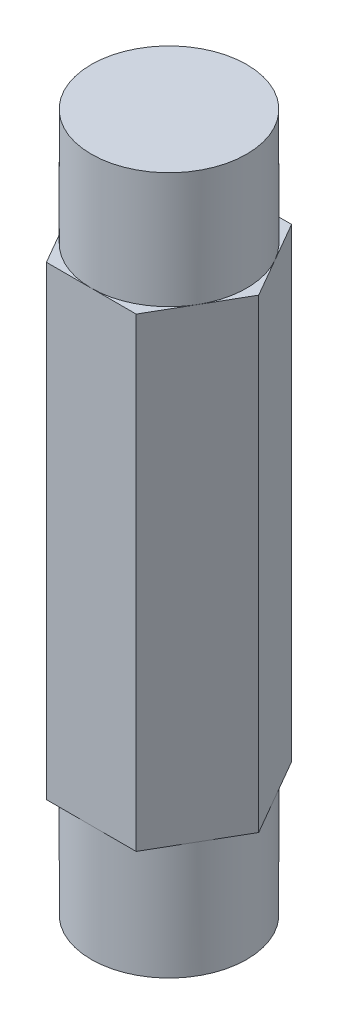
ISO-10303-21;
HEADER;
FILE_DESCRIPTION(('STEP AP214'),'2;1');
FILE_NAME('part.step','',(''),(''),'','','');
FILE_SCHEMA(('AUTOMOTIVE_DESIGN { 1 0 10303 214 1 1 1 1 }'));
ENDSEC;
DATA;
#1=APPLICATION_CONTEXT('core data for automotive mechanical design processes');
#2=APPLICATION_PROTOCOL_DEFINITION('international standard','automotive_design',2000,#1);
#3=PRODUCT_CONTEXT('',#1,'mechanical');
#4=PRODUCT('Part','Part','',(#3));
#5=PRODUCT_RELATED_PRODUCT_CATEGORY('part','',(#4));
#6=PRODUCT_DEFINITION_FORMATION('','',#4);
#7=PRODUCT_DEFINITION_CONTEXT('part definition',#1,'design');
#8=PRODUCT_DEFINITION('design','',#6,#7);
#9=PRODUCT_DEFINITION_SHAPE('','',#8);
#10=(LENGTH_UNIT() NAMED_UNIT(*) SI_UNIT(.MILLI.,.METRE.));
#11=(NAMED_UNIT(*) PLANE_ANGLE_UNIT() SI_UNIT($,.RADIAN.));
#12=(NAMED_UNIT(*) SI_UNIT($,.STERADIAN.) SOLID_ANGLE_UNIT());
#13=UNCERTAINTY_MEASURE_WITH_UNIT(LENGTH_MEASURE(1.E-05),#10,'distance_accuracy_value','');
#14=(GEOMETRIC_REPRESENTATION_CONTEXT(3) GLOBAL_UNCERTAINTY_ASSIGNED_CONTEXT((#13)) GLOBAL_UNIT_ASSIGNED_CONTEXT((#10,
#11,#12)) REPRESENTATION_CONTEXT('',''));
#15=CARTESIAN_POINT('',(0.,0.,0.));
#16=DIRECTION('',(0.,0.,1.));
#17=DIRECTION('',(1.,0.,0.));
#18=AXIS2_PLACEMENT_3D('',#15,#16,#17);
#19=CARTESIAN_POINT('',(2.74963065701559,42.7482,-4.7625));
#20=DIRECTION('',(-0.866025403784439,0.,0.5));
#21=DIRECTION('',(-0.5,0.,-0.866025403784439));
#22=AXIS2_PLACEMENT_3D('',#19,#20,#21);
#23=PLANE('',#22);
#24=DIRECTION('',(-0.5,0.,-0.866025403784439));
#25=VECTOR('',#24,1.);
#26=CARTESIAN_POINT('',(2.74963065701559,7.112,-4.7625));
#27=LINE('',#26,#25);
#28=CARTESIAN_POINT('',(5.49926131403118,7.112,0.));
#29=VERTEX_POINT('',#28);
#30=CARTESIAN_POINT('',(4.12444598552339,7.112,-2.38125));
#31=VERTEX_POINT('',#30);
#32=EDGE_CURVE('E301',#29,#31,#27,.T.);
#33=ORIENTED_EDGE('',*,*,#32,.T.);
#34=CARTESIAN_POINT('',(2.74963065701559,7.112,-4.7625));
#35=VERTEX_POINT('',#34);
#36=EDGE_CURVE('E304',#31,#35,#27,.T.);
#37=ORIENTED_EDGE('',*,*,#36,.T.);
#38=DIRECTION('',(0.,-1.,0.));
#39=VECTOR('',#38,1.);
#40=CARTESIAN_POINT('',(2.74963065701559,42.7482,-4.7625));
#41=LINE('',#40,#39);
#42=CARTESIAN_POINT('',(2.74963065701559,35.6362,-4.7625));
#43=VERTEX_POINT('',#42);
#44=EDGE_CURVE('E184',#43,#35,#41,.T.);
#45=ORIENTED_EDGE('',*,*,#44,.F.);
#46=DIRECTION('',(0.5,0.,0.866025403784439));
#47=VECTOR('',#46,1.);
#48=CARTESIAN_POINT('',(2.74963065701559,35.6362,-4.7625));
#49=LINE('',#48,#47);
#50=CARTESIAN_POINT('',(4.12444598552339,35.6362,-2.38125));
#51=VERTEX_POINT('',#50);
#52=EDGE_CURVE('E183',#43,#51,#49,.T.);
#53=ORIENTED_EDGE('',*,*,#52,.T.);
#54=CARTESIAN_POINT('',(5.49926131403118,35.6362,0.));
#55=VERTEX_POINT('',#54);
#56=EDGE_CURVE('E180',#51,#55,#49,.T.);
#57=ORIENTED_EDGE('',*,*,#56,.T.);
#58=DIRECTION('',(0.,-1.,0.));
#59=VECTOR('',#58,1.);
#60=CARTESIAN_POINT('',(5.49926131403118,42.7482,0.));
#61=LINE('',#60,#59);
#62=EDGE_CURVE('E196',#55,#29,#61,.T.);
#63=ORIENTED_EDGE('',*,*,#62,.T.);
#64=EDGE_LOOP('',(#33,#37,#45,#53,#57,#63));
#65=FACE_BOUND('',#64,.T.);
#66=ADVANCED_FACE('F35',(#65),#23,.F.);
#67=CARTESIAN_POINT('',(5.49926131403118,42.7482,0.));
#68=DIRECTION('',(-0.866025403784439,0.,-0.5));
#69=DIRECTION('',(0.5,0.,-0.866025403784439));
#70=AXIS2_PLACEMENT_3D('',#67,#68,#69);
#71=PLANE('',#70);
#72=DIRECTION('',(0.5,0.,-0.866025403784439));
#73=VECTOR('',#72,1.);
#74=CARTESIAN_POINT('',(5.49926131403118,7.112,0.));
#75=LINE('',#74,#73);
#76=CARTESIAN_POINT('',(2.74963065701559,7.112,4.7625));
#77=VERTEX_POINT('',#76);
#78=CARTESIAN_POINT('',(4.12444598552339,7.112,2.38125));
#79=VERTEX_POINT('',#78);
#80=EDGE_CURVE('E146',#77,#79,#75,.T.);
#81=ORIENTED_EDGE('',*,*,#80,.T.);
#82=EDGE_CURVE('E160',#79,#29,#75,.T.);
#83=ORIENTED_EDGE('',*,*,#82,.T.);
#84=ORIENTED_EDGE('',*,*,#62,.F.);
#85=DIRECTION('',(-0.5,0.,0.866025403784439));
#86=VECTOR('',#85,1.);
#87=CARTESIAN_POINT('',(5.49926131403118,35.6362,0.));
#88=LINE('',#87,#86);
#89=CARTESIAN_POINT('',(4.12444598552339,35.6362,2.38125));
#90=VERTEX_POINT('',#89);
#91=EDGE_CURVE('E179',#55,#90,#88,.T.);
#92=ORIENTED_EDGE('',*,*,#91,.T.);
#93=CARTESIAN_POINT('',(2.74963065701559,35.6362,4.7625));
#94=VERTEX_POINT('',#93);
#95=EDGE_CURVE('E176',#90,#94,#88,.T.);
#96=ORIENTED_EDGE('',*,*,#95,.T.);
#97=DIRECTION('',(0.,-1.,0.));
#98=VECTOR('',#97,1.);
#99=CARTESIAN_POINT('',(2.74963065701559,42.7482,4.7625));
#100=LINE('',#99,#98);
#101=EDGE_CURVE('E194',#94,#77,#100,.T.);
#102=ORIENTED_EDGE('',*,*,#101,.T.);
#103=EDGE_LOOP('',(#81,#83,#84,#92,#96,#102));
#104=FACE_BOUND('',#103,.T.);
#105=ADVANCED_FACE('F244',(#104),#71,.F.);
#106=CARTESIAN_POINT('',(2.74963065701559,42.7482,4.7625));
#107=DIRECTION('',(0.,0.,-1.));
#108=DIRECTION('',(1.,0.,0.));
#109=AXIS2_PLACEMENT_3D('',#106,#107,#108);
#110=PLANE('',#109);
#111=DIRECTION('',(1.,0.,0.));
#112=VECTOR('',#111,1.);
#113=CARTESIAN_POINT('',(2.74963065701559,7.112,4.7625));
#114=LINE('',#113,#112);
#115=CARTESIAN_POINT('',(-2.74963065701559,7.112,4.7625));
#116=VERTEX_POINT('',#115);
#117=CARTESIAN_POINT('',(0.,7.112,4.7625));
#118=VERTEX_POINT('',#117);
#119=EDGE_CURVE('E139',#116,#118,#114,.T.);
#120=ORIENTED_EDGE('',*,*,#119,.T.);
#121=EDGE_CURVE('E143',#118,#77,#114,.T.);
#122=ORIENTED_EDGE('',*,*,#121,.T.);
#123=ORIENTED_EDGE('',*,*,#101,.F.);
#124=DIRECTION('',(-1.,0.,0.));
#125=VECTOR('',#124,1.);
#126=CARTESIAN_POINT('',(2.74963065701559,35.6362,4.7625));
#127=LINE('',#126,#125);
#128=CARTESIAN_POINT('',(0.,35.6362,4.7625));
#129=VERTEX_POINT('',#128);
#130=EDGE_CURVE('E175',#94,#129,#127,.T.);
#131=ORIENTED_EDGE('',*,*,#130,.T.);
#132=CARTESIAN_POINT('',(-2.74963065701559,35.6362,4.7625));
#133=VERTEX_POINT('',#132);
#134=EDGE_CURVE('E173',#129,#133,#127,.T.);
#135=ORIENTED_EDGE('',*,*,#134,.T.);
#136=DIRECTION('',(0.,-1.,0.));
#137=VECTOR('',#136,1.);
#138=CARTESIAN_POINT('',(-2.74963065701559,42.7482,4.7625));
#139=LINE('',#138,#137);
#140=EDGE_CURVE('E155',#133,#116,#139,.T.);
#141=ORIENTED_EDGE('',*,*,#140,.T.);
#142=EDGE_LOOP('',(#120,#122,#123,#131,#135,#141));
#143=FACE_BOUND('',#142,.T.);
#144=ADVANCED_FACE('F152',(#143),#110,.F.);
#145=CARTESIAN_POINT('',(-2.74963065701559,42.7482,4.7625));
#146=DIRECTION('',(0.866025403784439,0.,-0.5));
#147=DIRECTION('',(0.5,0.,0.866025403784439));
#148=AXIS2_PLACEMENT_3D('',#145,#146,#147);
#149=PLANE('',#148);
#150=DIRECTION('',(0.5,0.,0.866025403784439));
#151=VECTOR('',#150,1.);
#152=CARTESIAN_POINT('',(-2.74963065701559,7.112,4.7625));
#153=LINE('',#152,#151);
#154=CARTESIAN_POINT('',(-5.49926131403119,7.112,0.));
#155=VERTEX_POINT('',#154);
#156=CARTESIAN_POINT('',(-4.12444598552339,7.112,2.38125));
#157=VERTEX_POINT('',#156);
#158=EDGE_CURVE('E298',#155,#157,#153,.T.);
#159=ORIENTED_EDGE('',*,*,#158,.T.);
#160=EDGE_CURVE('E140',#157,#116,#153,.T.);
#161=ORIENTED_EDGE('',*,*,#160,.T.);
#162=ORIENTED_EDGE('',*,*,#140,.F.);
#163=DIRECTION('',(-0.5,0.,-0.866025403784439));
#164=VECTOR('',#163,1.);
#165=CARTESIAN_POINT('',(-2.74963065701559,35.6362,4.7625));
#166=LINE('',#165,#164);
#167=CARTESIAN_POINT('',(-4.12444598552339,35.6362,2.38125));
#168=VERTEX_POINT('',#167);
#169=EDGE_CURVE('E172',#133,#168,#166,.T.);
#170=ORIENTED_EDGE('',*,*,#169,.T.);
#171=CARTESIAN_POINT('',(-5.49926131403119,35.6362,0.));
#172=VERTEX_POINT('',#171);
#173=EDGE_CURVE('E169',#168,#172,#166,.T.);
#174=ORIENTED_EDGE('',*,*,#173,.T.);
#175=DIRECTION('',(0.,-1.,0.));
#176=VECTOR('',#175,1.);
#177=CARTESIAN_POINT('',(-5.49926131403119,42.7482,0.));
#178=LINE('',#177,#176);
#179=EDGE_CURVE('E190',#172,#155,#178,.T.);
#180=ORIENTED_EDGE('',*,*,#179,.T.);
#181=EDGE_LOOP('',(#159,#161,#162,#170,#174,#180));
#182=FACE_BOUND('',#181,.T.);
#183=ADVANCED_FACE('F272',(#182),#149,.F.);
#184=CARTESIAN_POINT('',(-5.49926131403119,42.7482,0.));
#185=DIRECTION('',(0.866025403784439,0.,0.5));
#186=DIRECTION('',(-0.5,0.,0.866025403784439));
#187=AXIS2_PLACEMENT_3D('',#184,#185,#186);
#188=PLANE('',#187);
#189=DIRECTION('',(-0.5,0.,0.866025403784439));
#190=VECTOR('',#189,1.);
#191=CARTESIAN_POINT('',(-5.49926131403119,7.112,0.));
#192=LINE('',#191,#190);
#193=CARTESIAN_POINT('',(-2.74963065701559,7.112,-4.7625));
#194=VERTEX_POINT('',#193);
#195=CARTESIAN_POINT('',(-4.12444598552339,7.112,-2.38125));
#196=VERTEX_POINT('',#195);
#197=EDGE_CURVE('E133',#194,#196,#192,.T.);
#198=ORIENTED_EDGE('',*,*,#197,.T.);
#199=EDGE_CURVE('E299',#196,#155,#192,.T.);
#200=ORIENTED_EDGE('',*,*,#199,.T.);
#201=ORIENTED_EDGE('',*,*,#179,.F.);
#202=DIRECTION('',(0.5,0.,-0.866025403784439));
#203=VECTOR('',#202,1.);
#204=CARTESIAN_POINT('',(-5.49926131403119,35.6362,0.));
#205=LINE('',#204,#203);
#206=CARTESIAN_POINT('',(-4.12444598552339,35.6362,-2.38125));
#207=VERTEX_POINT('',#206);
#208=EDGE_CURVE('E168',#172,#207,#205,.T.);
#209=ORIENTED_EDGE('',*,*,#208,.T.);
#210=CARTESIAN_POINT('',(-2.74963065701559,35.6362,-4.7625));
#211=VERTEX_POINT('',#210);
#212=EDGE_CURVE('E164',#207,#211,#205,.T.);
#213=ORIENTED_EDGE('',*,*,#212,.T.);
#214=DIRECTION('',(0.,-1.,0.));
#215=VECTOR('',#214,1.);
#216=CARTESIAN_POINT('',(-2.74963065701559,42.7482,-4.7625));
#217=LINE('',#216,#215);
#218=EDGE_CURVE('E187',#211,#194,#217,.T.);
#219=ORIENTED_EDGE('',*,*,#218,.T.);
#220=EDGE_LOOP('',(#198,#200,#201,#209,#213,#219));
#221=FACE_BOUND('',#220,.T.);
#222=ADVANCED_FACE('F219',(#221),#188,.F.);
#223=CARTESIAN_POINT('',(-2.74963065701559,42.7482,-4.7625));
#224=DIRECTION('',(0.,0.,1.));
#225=DIRECTION('',(-1.,0.,0.));
#226=AXIS2_PLACEMENT_3D('',#223,#224,#225);
#227=PLANE('',#226);
#228=DIRECTION('',(-1.,0.,0.));
#229=VECTOR('',#228,1.);
#230=CARTESIAN_POINT('',(-2.74963065701559,7.112,-4.7625));
#231=LINE('',#230,#229);
#232=CARTESIAN_POINT('',(0.,7.112,-4.7625));
#233=VERTEX_POINT('',#232);
#234=EDGE_CURVE('E11',#35,#233,#231,.T.);
#235=ORIENTED_EDGE('',*,*,#234,.T.);
#236=EDGE_CURVE('E38',#233,#194,#231,.T.);
#237=ORIENTED_EDGE('',*,*,#236,.T.);
#238=ORIENTED_EDGE('',*,*,#218,.F.);
#239=DIRECTION('',(1.,0.,0.));
#240=VECTOR('',#239,1.);
#241=CARTESIAN_POINT('',(-2.74963065701559,35.6362,-4.7625));
#242=LINE('',#241,#240);
#243=CARTESIAN_POINT('',(0.,35.6362,-4.7625));
#244=VERTEX_POINT('',#243);
#245=EDGE_CURVE('E203',#211,#244,#242,.T.);
#246=ORIENTED_EDGE('',*,*,#245,.T.);
#247=EDGE_CURVE('E202',#244,#43,#242,.T.);
#248=ORIENTED_EDGE('',*,*,#247,.T.);
#249=ORIENTED_EDGE('',*,*,#44,.T.);
#250=EDGE_LOOP('',(#235,#237,#238,#246,#248,#249));
#251=FACE_BOUND('',#250,.T.);
#252=ADVANCED_FACE('F211',(#251),#227,.F.);
#253=CARTESIAN_POINT('',(0.,35.6362,0.));
#254=DIRECTION('',(0.,1.,0.));
#255=DIRECTION('',(0.,0.,-1.));
#256=AXIS2_PLACEMENT_3D('',#253,#254,#255);
#257=PLANE('',#256);
#258=ORIENTED_EDGE('',*,*,#52,.F.);
#259=ORIENTED_EDGE('',*,*,#247,.F.);
#260=CARTESIAN_POINT('',(0.,35.6362,0.));
#261=DIRECTION('',(0.,-1.,0.));
#262=DIRECTION('',(0.,0.,-1.));
#263=AXIS2_PLACEMENT_3D('',#260,#261,#262);
#264=CIRCLE('',#263,4.7625);
#265=EDGE_CURVE('E158',#244,#51,#264,.T.);
#266=ORIENTED_EDGE('',*,*,#265,.T.);
#267=EDGE_LOOP('',(#258,#259,#266));
#268=FACE_BOUND('',#267,.T.);
#269=ADVANCED_FACE('F251',(#268),#257,.T.);
#270=ORIENTED_EDGE('',*,*,#56,.F.);
#271=EDGE_CURVE('E165',#51,#90,#264,.T.);
#272=ORIENTED_EDGE('',*,*,#271,.T.);
#273=ORIENTED_EDGE('',*,*,#91,.F.);
#274=EDGE_LOOP('',(#270,#272,#273));
#275=FACE_BOUND('',#274,.T.);
#276=ADVANCED_FACE('F237',(#275),#257,.T.);
#277=ORIENTED_EDGE('',*,*,#95,.F.);
#278=EDGE_CURVE('E228',#90,#129,#264,.T.);
#279=ORIENTED_EDGE('',*,*,#278,.T.);
#280=ORIENTED_EDGE('',*,*,#130,.F.);
#281=EDGE_LOOP('',(#277,#279,#280));
#282=FACE_BOUND('',#281,.T.);
#283=ADVANCED_FACE('F241',(#282),#257,.T.);
#284=ORIENTED_EDGE('',*,*,#134,.F.);
#285=EDGE_CURVE('E227',#129,#168,#264,.T.);
#286=ORIENTED_EDGE('',*,*,#285,.T.);
#287=ORIENTED_EDGE('',*,*,#169,.F.);
#288=EDGE_LOOP('',(#284,#286,#287));
#289=FACE_BOUND('',#288,.T.);
#290=ADVANCED_FACE('F291',(#289),#257,.T.);
#291=ORIENTED_EDGE('',*,*,#173,.F.);
#292=EDGE_CURVE('E156',#168,#207,#264,.T.);
#293=ORIENTED_EDGE('',*,*,#292,.T.);
#294=ORIENTED_EDGE('',*,*,#208,.F.);
#295=EDGE_LOOP('',(#291,#293,#294));
#296=FACE_BOUND('',#295,.T.);
#297=ADVANCED_FACE('F223',(#296),#257,.T.);
#298=ORIENTED_EDGE('',*,*,#212,.F.);
#299=EDGE_CURVE('E57',#207,#244,#264,.T.);
#300=ORIENTED_EDGE('',*,*,#299,.T.);
#301=ORIENTED_EDGE('',*,*,#245,.F.);
#302=EDGE_LOOP('',(#298,#300,#301));
#303=FACE_BOUND('',#302,.T.);
#304=ADVANCED_FACE('F214',(#303),#257,.T.);
#305=CARTESIAN_POINT('',(0.,35.6362,0.));
#306=DIRECTION('',(0.,1.,0.));
#307=DIRECTION('',(0.,0.,-1.));
#308=AXIS2_PLACEMENT_3D('',#305,#306,#307);
#309=CYLINDRICAL_SURFACE('',#308,4.7625);
#310=CARTESIAN_POINT('',(0.,42.7482,0.));
#311=DIRECTION('',(0.,-1.,0.));
#312=DIRECTION('',(0.,0.,-1.));
#313=AXIS2_PLACEMENT_3D('',#310,#311,#312);
#314=CIRCLE('',#313,4.7625);
#315=CARTESIAN_POINT('',(0.,42.7482,-4.7625));
#316=VERTEX_POINT('',#315);
#317=EDGE_CURVE('E199',#316,#316,#314,.T.);
#318=ORIENTED_EDGE('',*,*,#317,.T.);
#319=EDGE_LOOP('',(#318));
#320=FACE_BOUND('',#319,.T.);
#321=ORIENTED_EDGE('',*,*,#265,.F.);
#322=ORIENTED_EDGE('',*,*,#299,.F.);
#323=ORIENTED_EDGE('',*,*,#292,.F.);
#324=ORIENTED_EDGE('',*,*,#285,.F.);
#325=ORIENTED_EDGE('',*,*,#278,.F.);
#326=ORIENTED_EDGE('',*,*,#271,.F.);
#327=EDGE_LOOP('',(#321,#322,#323,#324,#325,#326));
#328=FACE_BOUND('',#327,.T.);
#329=ADVANCED_FACE('F252',(#320,#328),#309,.T.);
#330=CARTESIAN_POINT('',(0.,42.7482,0.));
#331=DIRECTION('',(0.,1.,0.));
#332=DIRECTION('',(0.,0.,-1.));
#333=AXIS2_PLACEMENT_3D('',#330,#331,#332);
#334=PLANE('',#333);
#335=ORIENTED_EDGE('',*,*,#317,.F.);
#336=EDGE_LOOP('',(#335));
#337=FACE_BOUND('',#336,.T.);
#338=ADVANCED_FACE('F254',(#337),#334,.T.);
#339=CARTESIAN_POINT('',(0.,7.112,0.));
#340=DIRECTION('',(0.,-1.,0.));
#341=DIRECTION('',(0.,0.,1.));
#342=AXIS2_PLACEMENT_3D('',#339,#340,#341);
#343=PLANE('',#342);
#344=ORIENTED_EDGE('',*,*,#119,.F.);
#345=ORIENTED_EDGE('',*,*,#160,.F.);
#346=CARTESIAN_POINT('',(0.,7.112,0.));
#347=DIRECTION('',(0.,1.,0.));
#348=DIRECTION('',(0.,0.,1.));
#349=AXIS2_PLACEMENT_3D('',#346,#347,#348);
#350=CIRCLE('',#349,4.7625);
#351=EDGE_CURVE('E125',#157,#118,#350,.T.);
#352=ORIENTED_EDGE('',*,*,#351,.T.);
#353=EDGE_LOOP('',(#344,#345,#352));
#354=FACE_BOUND('',#353,.T.);
#355=ADVANCED_FACE('F137',(#354),#343,.T.);
#356=ORIENTED_EDGE('',*,*,#121,.F.);
#357=EDGE_CURVE('E122',#118,#79,#350,.T.);
#358=ORIENTED_EDGE('',*,*,#357,.T.);
#359=ORIENTED_EDGE('',*,*,#80,.F.);
#360=EDGE_LOOP('',(#356,#358,#359));
#361=FACE_BOUND('',#360,.T.);
#362=ADVANCED_FACE('F144',(#361),#343,.T.);
#363=ORIENTED_EDGE('',*,*,#82,.F.);
#364=EDGE_CURVE('E128',#79,#31,#350,.T.);
#365=ORIENTED_EDGE('',*,*,#364,.T.);
#366=ORIENTED_EDGE('',*,*,#32,.F.);
#367=EDGE_LOOP('',(#363,#365,#366));
#368=FACE_BOUND('',#367,.T.);
#369=ADVANCED_FACE('F315',(#368),#343,.T.);
#370=ORIENTED_EDGE('',*,*,#158,.F.);
#371=ORIENTED_EDGE('',*,*,#199,.F.);
#372=EDGE_CURVE('E142',#196,#157,#350,.T.);
#373=ORIENTED_EDGE('',*,*,#372,.T.);
#374=EDGE_LOOP('',(#370,#371,#373));
#375=FACE_BOUND('',#374,.T.);
#376=ADVANCED_FACE('F312',(#375),#343,.T.);
#377=ORIENTED_EDGE('',*,*,#36,.F.);
#378=EDGE_CURVE('E310',#31,#233,#350,.T.);
#379=ORIENTED_EDGE('',*,*,#378,.T.);
#380=ORIENTED_EDGE('',*,*,#234,.F.);
#381=EDGE_LOOP('',(#377,#379,#380));
#382=FACE_BOUND('',#381,.T.);
#383=ADVANCED_FACE('F314',(#382),#343,.T.);
#384=ORIENTED_EDGE('',*,*,#197,.F.);
#385=ORIENTED_EDGE('',*,*,#236,.F.);
#386=EDGE_CURVE('E49',#233,#196,#350,.T.);
#387=ORIENTED_EDGE('',*,*,#386,.T.);
#388=EDGE_LOOP('',(#384,#385,#387));
#389=FACE_BOUND('',#388,.T.);
#390=ADVANCED_FACE('F309',(#389),#343,.T.);
#391=CARTESIAN_POINT('',(0.,7.112,0.));
#392=DIRECTION('',(0.,-1.,0.));
#393=DIRECTION('',(0.,0.,1.));
#394=AXIS2_PLACEMENT_3D('',#391,#392,#393);
#395=CYLINDRICAL_SURFACE('',#394,4.7625);
#396=CARTESIAN_POINT('',(0.,0.,0.));
#397=DIRECTION('',(0.,-1.,0.));
#398=DIRECTION('',(0.,0.,-1.));
#399=AXIS2_PLACEMENT_3D('',#396,#397,#398);
#400=CIRCLE('',#399,4.7625);
#401=CARTESIAN_POINT('',(0.,0.,-4.7625));
#402=VERTEX_POINT('',#401);
#403=EDGE_CURVE('E204',#402,#402,#400,.T.);
#404=ORIENTED_EDGE('',*,*,#403,.F.);
#405=EDGE_LOOP('',(#404));
#406=FACE_BOUND('',#405,.T.);
#407=ORIENTED_EDGE('',*,*,#364,.F.);
#408=ORIENTED_EDGE('',*,*,#357,.F.);
#409=ORIENTED_EDGE('',*,*,#351,.F.);
#410=ORIENTED_EDGE('',*,*,#372,.F.);
#411=ORIENTED_EDGE('',*,*,#386,.F.);
#412=ORIENTED_EDGE('',*,*,#378,.F.);
#413=EDGE_LOOP('',(#407,#408,#409,#410,#411,#412));
#414=FACE_BOUND('',#413,.T.);
#415=ADVANCED_FACE('F124',(#406,#414),#395,.T.);
#416=CARTESIAN_POINT('',(0.,0.,0.));
#417=DIRECTION('',(0.,1.,0.));
#418=DIRECTION('',(0.,0.,-1.));
#419=AXIS2_PLACEMENT_3D('',#416,#417,#418);
#420=PLANE('',#419);
#421=ORIENTED_EDGE('',*,*,#403,.T.);
#422=EDGE_LOOP('',(#421));
#423=FACE_BOUND('',#422,.T.);
#424=ADVANCED_FACE('F282',(#423),#420,.F.);
#425=CLOSED_SHELL('',(#66,#105,#144,#183,#222,#252,#269,#276,#283,#290,#297,#304,#329,#338,#355,
#362,#369,#376,#383,#390,#415,#424));
#426=MANIFOLD_SOLID_BREP('B2',#425);
#427=ADVANCED_BREP_SHAPE_REPRESENTATION('',(#18,#426),#14);
#428=SHAPE_DEFINITION_REPRESENTATION(#9,#427);
ENDSEC;
END-ISO-10303-21;
